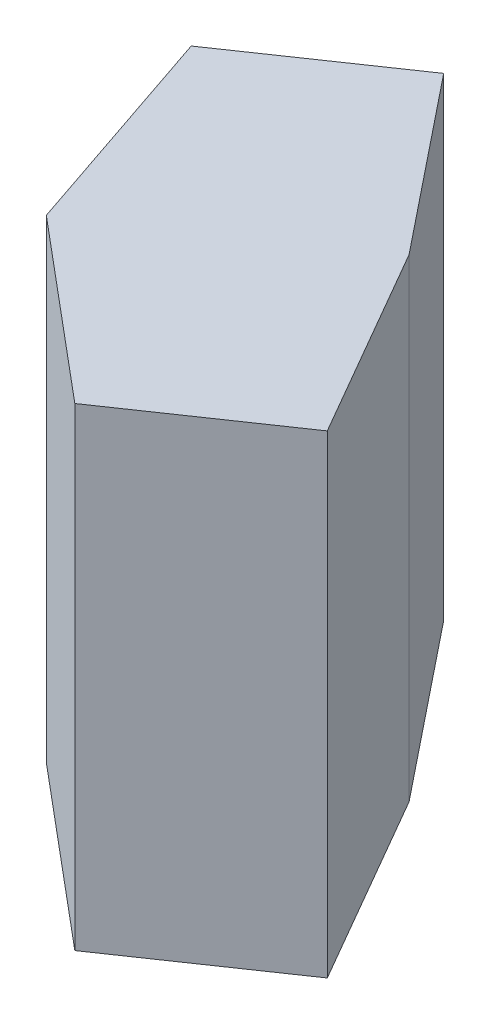
ISO-10303-21;
HEADER;
FILE_DESCRIPTION(('STEP AP214'),'2;1');
FILE_NAME('part.step','',(''),(''),'','','');
FILE_SCHEMA(('AUTOMOTIVE_DESIGN { 1 0 10303 214 1 1 1 1 }'));
ENDSEC;
DATA;
#1=APPLICATION_CONTEXT('core data for automotive mechanical design processes');
#2=APPLICATION_PROTOCOL_DEFINITION('international standard','automotive_design',2000,#1);
#3=PRODUCT_CONTEXT('',#1,'mechanical');
#4=PRODUCT('Part','Part','',(#3));
#5=PRODUCT_RELATED_PRODUCT_CATEGORY('part','',(#4));
#6=PRODUCT_DEFINITION_FORMATION('','',#4);
#7=PRODUCT_DEFINITION_CONTEXT('part definition',#1,'design');
#8=PRODUCT_DEFINITION('design','',#6,#7);
#9=PRODUCT_DEFINITION_SHAPE('','',#8);
#10=(LENGTH_UNIT() NAMED_UNIT(*) SI_UNIT(.MILLI.,.METRE.));
#11=(NAMED_UNIT(*) PLANE_ANGLE_UNIT() SI_UNIT($,.RADIAN.));
#12=(NAMED_UNIT(*) SI_UNIT($,.STERADIAN.) SOLID_ANGLE_UNIT());
#13=UNCERTAINTY_MEASURE_WITH_UNIT(LENGTH_MEASURE(1.E-05),#10,'distance_accuracy_value','');
#14=(GEOMETRIC_REPRESENTATION_CONTEXT(3) GLOBAL_UNCERTAINTY_ASSIGNED_CONTEXT((#13)) GLOBAL_UNIT_ASSIGNED_CONTEXT((#10,
#11,#12)) REPRESENTATION_CONTEXT('',''));
#15=CARTESIAN_POINT('',(0.,0.,0.));
#16=DIRECTION('',(0.,0.,1.));
#17=DIRECTION('',(1.,0.,0.));
#18=AXIS2_PLACEMENT_3D('',#15,#16,#17);
#19=CARTESIAN_POINT('',(-11.1304941251948,6.5,-9.33959351527203));
#20=DIRECTION('',(0.642787609686546,0.,-0.766044443118972));
#21=DIRECTION('',(-0.766044443118972,0.,-0.642787609686546));
#22=AXIS2_PLACEMENT_3D('',#19,#20,#21);
#23=PLANE('',#22);
#24=DIRECTION('',(0.766044443118972,0.,0.642787609686546));
#25=VECTOR('',#24,1.);
#26=CARTESIAN_POINT('',(-11.1304941251948,-6.5,-9.33959351527203));
#27=LINE('',#26,#25);
#28=CARTESIAN_POINT('',(-15.9927021240713,-6.5,-13.4194704538365));
#29=VERTEX_POINT('',#28);
#30=CARTESIAN_POINT('',(-11.1304941251948,-6.5,-9.33959351527203));
#31=VERTEX_POINT('',#30);
#32=EDGE_CURVE('E115',#29,#31,#27,.T.);
#33=ORIENTED_EDGE('',*,*,#32,.T.);
#34=DIRECTION('',(0.,-1.,0.));
#35=VECTOR('',#34,1.);
#36=CARTESIAN_POINT('',(-11.1304941251948,6.5,-9.33959351527203));
#37=LINE('',#36,#35);
#38=CARTESIAN_POINT('',(-11.1304941251948,6.5,-9.33959351527203));
#39=VERTEX_POINT('',#38);
#40=EDGE_CURVE('E11',#39,#31,#37,.T.);
#41=ORIENTED_EDGE('',*,*,#40,.F.);
#42=DIRECTION('',(0.766044443118972,0.,0.642787609686546));
#43=VECTOR('',#42,1.);
#44=CARTESIAN_POINT('',(-11.1304941251948,6.5,-9.33959351527203));
#45=LINE('',#44,#43);
#46=CARTESIAN_POINT('',(-15.9927021240713,6.5,-13.4194704538365));
#47=VERTEX_POINT('',#46);
#48=EDGE_CURVE('E55',#47,#39,#45,.T.);
#49=ORIENTED_EDGE('',*,*,#48,.F.);
#50=DIRECTION('',(0.,-1.,0.));
#51=VECTOR('',#50,1.);
#52=CARTESIAN_POINT('',(-15.9927021240713,6.5,-13.4194704538365));
#53=LINE('',#52,#51);
#54=EDGE_CURVE('E74',#47,#29,#53,.T.);
#55=ORIENTED_EDGE('',*,*,#54,.T.);
#56=EDGE_LOOP('',(#33,#41,#49,#55));
#57=FACE_BOUND('',#56,.T.);
#58=ADVANCED_FACE('F39',(#57),#23,.F.);
#59=CARTESIAN_POINT('',(-7.0156967512162,6.5,-12.1515432236024));
#60=DIRECTION('',(-0.564213962948635,0.,-0.825628611431191));
#61=DIRECTION('',(-0.825628611431191,0.,0.564213962948635));
#62=AXIS2_PLACEMENT_3D('',#59,#60,#61);
#63=PLANE('',#62);
#64=DIRECTION('',(0.825628611431191,0.,-0.564213962948635));
#65=VECTOR('',#64,1.);
#66=CARTESIAN_POINT('',(-7.0156967512162,-6.5,-12.1515432236024));
#67=LINE('',#66,#65);
#68=CARTESIAN_POINT('',(-7.0156967512162,-6.5,-12.1515432236024));
#69=VERTEX_POINT('',#68);
#70=EDGE_CURVE('E69',#31,#69,#67,.T.);
#71=ORIENTED_EDGE('',*,*,#70,.T.);
#72=DIRECTION('',(0.,-1.,0.));
#73=VECTOR('',#72,1.);
#74=CARTESIAN_POINT('',(-7.0156967512162,6.5,-12.1515432236024));
#75=LINE('',#74,#73);
#76=CARTESIAN_POINT('',(-7.0156967512162,6.5,-12.1515432236024));
#77=VERTEX_POINT('',#76);
#78=EDGE_CURVE('E47',#77,#69,#75,.T.);
#79=ORIENTED_EDGE('',*,*,#78,.F.);
#80=DIRECTION('',(0.825628611431191,0.,-0.564213962948635));
#81=VECTOR('',#80,1.);
#82=CARTESIAN_POINT('',(-7.0156967512162,6.5,-12.1515432236024));
#83=LINE('',#82,#81);
#84=EDGE_CURVE('E79',#39,#77,#83,.T.);
#85=ORIENTED_EDGE('',*,*,#84,.F.);
#86=ORIENTED_EDGE('',*,*,#40,.T.);
#87=EDGE_LOOP('',(#71,#79,#85,#86));
#88=FACE_BOUND('',#87,.T.);
#89=ADVANCED_FACE('F157',(#88),#63,.F.);
#90=CARTESIAN_POINT('',(-10.0807877289816,6.5,-17.460436526913));
#91=DIRECTION('',(-0.866025403784438,0.,0.500000000000002));
#92=DIRECTION('',(0.500000000000002,0.,0.866025403784438));
#93=AXIS2_PLACEMENT_3D('',#90,#91,#92);
#94=PLANE('',#93);
#95=DIRECTION('',(-0.500000000000002,0.,-0.866025403784438));
#96=VECTOR('',#95,1.);
#97=CARTESIAN_POINT('',(-10.0807877289816,-6.5,-17.460436526913));
#98=LINE('',#97,#96);
#99=CARTESIAN_POINT('',(-10.0807877289816,-6.5,-17.460436526913));
#100=VERTEX_POINT('',#99);
#101=EDGE_CURVE('E134',#69,#100,#98,.T.);
#102=ORIENTED_EDGE('',*,*,#101,.T.);
#103=DIRECTION('',(0.,-1.,0.));
#104=VECTOR('',#103,1.);
#105=CARTESIAN_POINT('',(-10.0807877289816,6.5,-17.460436526913));
#106=LINE('',#105,#104);
#107=CARTESIAN_POINT('',(-10.0807877289816,6.5,-17.460436526913));
#108=VERTEX_POINT('',#107);
#109=EDGE_CURVE('E129',#108,#100,#106,.T.);
#110=ORIENTED_EDGE('',*,*,#109,.F.);
#111=DIRECTION('',(-0.500000000000002,0.,-0.866025403784438));
#112=VECTOR('',#111,1.);
#113=CARTESIAN_POINT('',(-10.0807877289816,6.5,-17.460436526913));
#114=LINE('',#113,#112);
#115=EDGE_CURVE('E136',#77,#108,#114,.T.);
#116=ORIENTED_EDGE('',*,*,#115,.F.);
#117=ORIENTED_EDGE('',*,*,#78,.T.);
#118=EDGE_LOOP('',(#102,#110,#116,#117));
#119=FACE_BOUND('',#118,.T.);
#120=ADVANCED_FACE('F143',(#119),#94,.F.);
#121=CARTESIAN_POINT('',(0.,6.5,0.));
#122=DIRECTION('',(0.,-1.,0.));
#123=DIRECTION('',(0.,0.,-1.));
#124=AXIS2_PLACEMENT_3D('',#121,#122,#123);
#125=PLANE('',#124);
#126=ORIENTED_EDGE('',*,*,#48,.T.);
#127=ORIENTED_EDGE('',*,*,#84,.T.);
#128=ORIENTED_EDGE('',*,*,#115,.T.);
#129=DIRECTION('',(0.625344715223139,0.,0.780348631793823));
#130=VECTOR('',#129,1.);
#131=CARTESIAN_POINT('',(-10.0807877289816,6.5,-17.460436526913));
#132=LINE('',#131,#130);
#133=CARTESIAN_POINT('',(-13.914264618229,6.5,-22.2441156285587));
#134=VERTEX_POINT('',#133);
#135=EDGE_CURVE('E102',#134,#108,#132,.T.);
#136=ORIENTED_EDGE('',*,*,#135,.F.);
#137=DIRECTION('',(0.825510005569662,0.,-0.564387482767271));
#138=VECTOR('',#137,1.);
#139=CARTESIAN_POINT('',(-13.914264618229,6.5,-22.2441156285587));
#140=LINE('',#139,#138);
#141=CARTESIAN_POINT('',(-18.0284708800771,6.5,-19.4313011259562));
#142=VERTEX_POINT('',#141);
#143=EDGE_CURVE('E96',#142,#134,#140,.T.);
#144=ORIENTED_EDGE('',*,*,#143,.F.);
#145=DIRECTION('',(-0.320736863452546,0.,-0.947168340065599));
#146=VECTOR('',#145,1.);
#147=CARTESIAN_POINT('',(-18.0284708800771,6.5,-19.4313011259562));
#148=LINE('',#147,#146);
#149=EDGE_CURVE('E100',#47,#142,#148,.T.);
#150=ORIENTED_EDGE('',*,*,#149,.F.);
#151=EDGE_LOOP('',(#126,#127,#128,#136,#144,#150));
#152=FACE_BOUND('',#151,.T.);
#153=ADVANCED_FACE('F98',(#152),#125,.F.);
#154=CARTESIAN_POINT('',(0.,-6.5,0.));
#155=DIRECTION('',(0.,-1.,0.));
#156=DIRECTION('',(0.,0.,-1.));
#157=AXIS2_PLACEMENT_3D('',#154,#155,#156);
#158=PLANE('',#157);
#159=ORIENTED_EDGE('',*,*,#32,.F.);
#160=DIRECTION('',(-0.320736863452546,0.,-0.947168340065599));
#161=VECTOR('',#160,1.);
#162=CARTESIAN_POINT('',(-18.0284708800771,-6.5,-19.4313011259562));
#163=LINE('',#162,#161);
#164=CARTESIAN_POINT('',(-18.0284708800771,-6.5,-19.4313011259562));
#165=VERTEX_POINT('',#164);
#166=EDGE_CURVE('E125',#29,#165,#163,.T.);
#167=ORIENTED_EDGE('',*,*,#166,.T.);
#168=DIRECTION('',(0.825510005569662,0.,-0.564387482767271));
#169=VECTOR('',#168,1.);
#170=CARTESIAN_POINT('',(-13.914264618229,-6.5,-22.2441156285587));
#171=LINE('',#170,#169);
#172=CARTESIAN_POINT('',(-13.914264618229,-6.5,-22.2441156285587));
#173=VERTEX_POINT('',#172);
#174=EDGE_CURVE('E111',#165,#173,#171,.T.);
#175=ORIENTED_EDGE('',*,*,#174,.T.);
#176=DIRECTION('',(0.625344715223139,0.,0.780348631793823));
#177=VECTOR('',#176,1.);
#178=CARTESIAN_POINT('',(-10.0807877289816,-6.5,-17.460436526913));
#179=LINE('',#178,#177);
#180=EDGE_CURVE('E119',#173,#100,#179,.T.);
#181=ORIENTED_EDGE('',*,*,#180,.T.);
#182=ORIENTED_EDGE('',*,*,#101,.F.);
#183=ORIENTED_EDGE('',*,*,#70,.F.);
#184=EDGE_LOOP('',(#159,#167,#175,#181,#182,#183));
#185=FACE_BOUND('',#184,.T.);
#186=ADVANCED_FACE('F146',(#185),#158,.T.);
#187=CARTESIAN_POINT('',(-18.0284708800771,6.5,-19.4313011259562));
#188=DIRECTION('',(0.947168340065599,0.,-0.320736863452546));
#189=DIRECTION('',(0.320736863452546,0.,0.947168340065599));
#190=AXIS2_PLACEMENT_3D('',#187,#188,#189);
#191=PLANE('',#190);
#192=ORIENTED_EDGE('',*,*,#166,.F.);
#193=ORIENTED_EDGE('',*,*,#54,.F.);
#194=ORIENTED_EDGE('',*,*,#149,.T.);
#195=DIRECTION('',(0.,-1.,0.));
#196=VECTOR('',#195,1.);
#197=CARTESIAN_POINT('',(-18.0284708800771,6.5,-19.4313011259562));
#198=LINE('',#197,#196);
#199=EDGE_CURVE('E108',#142,#165,#198,.T.);
#200=ORIENTED_EDGE('',*,*,#199,.T.);
#201=EDGE_LOOP('',(#192,#193,#194,#200));
#202=FACE_BOUND('',#201,.T.);
#203=ADVANCED_FACE('F118',(#202),#191,.F.);
#204=CARTESIAN_POINT('',(-13.914264618229,6.5,-22.2441156285587));
#205=DIRECTION('',(0.56438748276727,0.,0.825510005569662));
#206=DIRECTION('',(-0.825510005569662,0.,0.564387482767271));
#207=AXIS2_PLACEMENT_3D('',#204,#205,#206);
#208=PLANE('',#207);
#209=ORIENTED_EDGE('',*,*,#174,.F.);
#210=ORIENTED_EDGE('',*,*,#199,.F.);
#211=ORIENTED_EDGE('',*,*,#143,.T.);
#212=DIRECTION('',(0.,-1.,0.));
#213=VECTOR('',#212,1.);
#214=CARTESIAN_POINT('',(-13.914264618229,6.5,-22.2441156285587));
#215=LINE('',#214,#213);
#216=EDGE_CURVE('E116',#134,#173,#215,.T.);
#217=ORIENTED_EDGE('',*,*,#216,.T.);
#218=EDGE_LOOP('',(#209,#210,#211,#217));
#219=FACE_BOUND('',#218,.T.);
#220=ADVANCED_FACE('F109',(#219),#208,.F.);
#221=CARTESIAN_POINT('',(-10.0807877289816,6.5,-17.460436526913));
#222=DIRECTION('',(-0.780348631793823,0.,0.625344715223139));
#223=DIRECTION('',(-0.625344715223139,0.,-0.780348631793823));
#224=AXIS2_PLACEMENT_3D('',#221,#222,#223);
#225=PLANE('',#224);
#226=ORIENTED_EDGE('',*,*,#180,.F.);
#227=ORIENTED_EDGE('',*,*,#216,.F.);
#228=ORIENTED_EDGE('',*,*,#135,.T.);
#229=ORIENTED_EDGE('',*,*,#109,.T.);
#230=EDGE_LOOP('',(#226,#227,#228,#229));
#231=FACE_BOUND('',#230,.T.);
#232=ADVANCED_FACE('F148',(#231),#225,.F.);
#233=CLOSED_SHELL('',(#58,#89,#120,#153,#186,#203,#220,#232));
#234=MANIFOLD_SOLID_BREP('B2',#233);
#235=ADVANCED_BREP_SHAPE_REPRESENTATION('',(#18,#234),#14);
#236=SHAPE_DEFINITION_REPRESENTATION(#9,#235);
ENDSEC;
END-ISO-10303-21;
